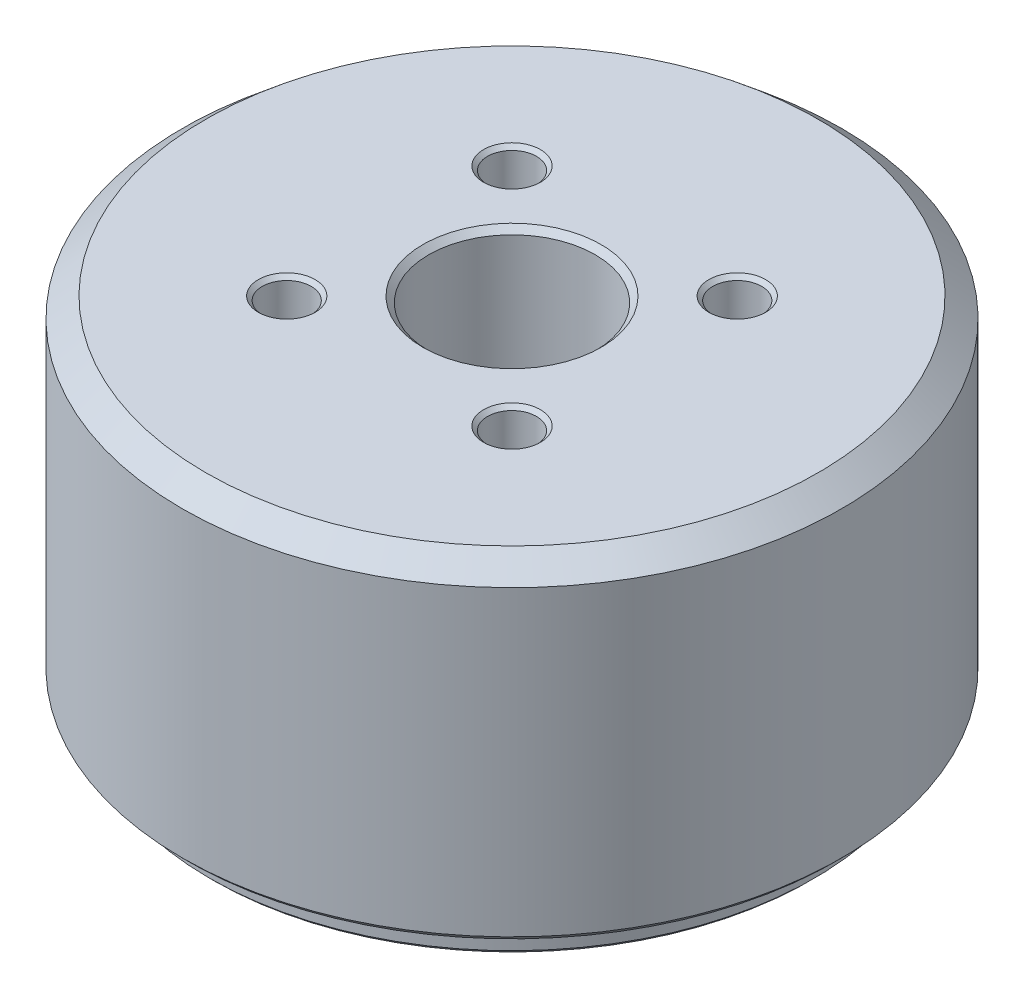
ISO-10303-21;
HEADER;
FILE_DESCRIPTION(('STEP AP214'),'2;1');
FILE_NAME('part.step','',(''),(''),'','','');
FILE_SCHEMA(('AUTOMOTIVE_DESIGN { 1 0 10303 214 1 1 1 1 }'));
ENDSEC;
DATA;
#1=APPLICATION_CONTEXT('core data for automotive mechanical design processes');
#2=APPLICATION_PROTOCOL_DEFINITION('international standard','automotive_design',2000,#1);
#3=PRODUCT_CONTEXT('',#1,'mechanical');
#4=PRODUCT('Part','Part','',(#3));
#5=PRODUCT_RELATED_PRODUCT_CATEGORY('part','',(#4));
#6=PRODUCT_DEFINITION_FORMATION('','',#4);
#7=PRODUCT_DEFINITION_CONTEXT('part definition',#1,'design');
#8=PRODUCT_DEFINITION('design','',#6,#7);
#9=PRODUCT_DEFINITION_SHAPE('','',#8);
#10=(LENGTH_UNIT() NAMED_UNIT(*) SI_UNIT(.MILLI.,.METRE.));
#11=(NAMED_UNIT(*) PLANE_ANGLE_UNIT() SI_UNIT($,.RADIAN.));
#12=(NAMED_UNIT(*) SI_UNIT($,.STERADIAN.) SOLID_ANGLE_UNIT());
#13=UNCERTAINTY_MEASURE_WITH_UNIT(LENGTH_MEASURE(1.E-05),#10,'distance_accuracy_value','');
#14=(GEOMETRIC_REPRESENTATION_CONTEXT(3) GLOBAL_UNCERTAINTY_ASSIGNED_CONTEXT((#13)) GLOBAL_UNIT_ASSIGNED_CONTEXT((#10,
#11,#12)) REPRESENTATION_CONTEXT('',''));
#15=CARTESIAN_POINT('',(0.,0.,0.));
#16=DIRECTION('',(0.,0.,1.));
#17=DIRECTION('',(1.,0.,0.));
#18=AXIS2_PLACEMENT_3D('',#15,#16,#17);
#19=CARTESIAN_POINT('',(0.,-1.76,0.));
#20=DIRECTION('',(0.,-1.,0.));
#21=DIRECTION('',(0.,0.,-1.));
#22=AXIS2_PLACEMENT_3D('',#19,#20,#21);
#23=PLANE('',#22);
#24=CARTESIAN_POINT('',(0.,-1.76,0.));
#25=DIRECTION('',(0.,-1.,0.));
#26=DIRECTION('',(0.,0.,-1.));
#27=AXIS2_PLACEMENT_3D('',#24,#25,#26);
#28=CIRCLE('',#27,5.39);
#29=CARTESIAN_POINT('',(0.,-1.76,-5.39));
#30=VERTEX_POINT('',#29);
#31=EDGE_CURVE('E45',#30,#30,#28,.T.);
#32=ORIENTED_EDGE('',*,*,#31,.T.);
#33=EDGE_LOOP('',(#32));
#34=FACE_BOUND('',#33,.T.);
#35=CARTESIAN_POINT('',(0.,-1.76,0.));
#36=DIRECTION('',(0.,-1.,0.));
#37=DIRECTION('',(0.,0.,-1.));
#38=AXIS2_PLACEMENT_3D('',#35,#36,#37);
#39=CIRCLE('',#38,4.55);
#40=CARTESIAN_POINT('',(0.,-1.76,-4.55));
#41=VERTEX_POINT('',#40);
#42=EDGE_CURVE('E226',#41,#41,#39,.F.);
#43=ORIENTED_EDGE('',*,*,#42,.T.);
#44=EDGE_LOOP('',(#43));
#45=FACE_BOUND('',#44,.T.);
#46=ADVANCED_FACE('F37',(#34,#45),#23,.T.);
#47=CARTESIAN_POINT('',(0.,-1.76,0.));
#48=DIRECTION('',(0.,1.,0.));
#49=DIRECTION('',(0.,0.,1.));
#50=AXIS2_PLACEMENT_3D('',#47,#48,#49);
#51=CYLINDRICAL_SURFACE('',#50,6.025);
#52=CARTESIAN_POINT('',(0.,0.,0.));
#53=DIRECTION('',(0.,1.,0.));
#54=DIRECTION('',(0.,0.,1.));
#55=AXIS2_PLACEMENT_3D('',#52,#53,#54);
#56=CIRCLE('',#55,6.025);
#57=CARTESIAN_POINT('',(0.,0.,6.025));
#58=VERTEX_POINT('',#57);
#59=EDGE_CURVE('E148',#58,#58,#56,.F.);
#60=ORIENTED_EDGE('',*,*,#59,.T.);
#61=EDGE_LOOP('',(#60));
#62=FACE_BOUND('',#61,.T.);
#63=CARTESIAN_POINT('',(0.,-0.500000000000002,0.));
#64=DIRECTION('',(0.,-1.,0.));
#65=DIRECTION('',(0.,0.,-1.));
#66=AXIS2_PLACEMENT_3D('',#63,#64,#65);
#67=CIRCLE('',#66,6.025);
#68=CARTESIAN_POINT('',(0.,-0.500000000000002,-6.025));
#69=VERTEX_POINT('',#68);
#70=EDGE_CURVE('E118',#69,#69,#67,.T.);
#71=ORIENTED_EDGE('',*,*,#70,.F.);
#72=EDGE_LOOP('',(#71));
#73=FACE_BOUND('',#72,.T.);
#74=ADVANCED_FACE('F243',(#62,#73),#51,.T.);
#75=CARTESIAN_POINT('',(0.,0.,0.));
#76=DIRECTION('',(0.,1.,0.));
#77=DIRECTION('',(0.,0.,1.));
#78=AXIS2_PLACEMENT_3D('',#75,#76,#77);
#79=PLANE('',#78);
#80=CARTESIAN_POINT('',(-7.75,0.,-7.75));
#81=DIRECTION('',(0.,1.,0.));
#82=DIRECTION('',(0.,0.,1.));
#83=AXIS2_PLACEMENT_3D('',#80,#81,#82);
#84=CIRCLE('',#83,1.4499999999921);
#85=CARTESIAN_POINT('',(-7.75,0.,-6.3000000000079));
#86=VERTEX_POINT('',#85);
#87=EDGE_CURVE('E181',#86,#86,#84,.T.);
#88=ORIENTED_EDGE('',*,*,#87,.T.);
#89=EDGE_LOOP('',(#88));
#90=FACE_BOUND('',#89,.T.);
#91=CARTESIAN_POINT('',(7.75,0.,-7.75));
#92=DIRECTION('',(0.,1.,0.));
#93=DIRECTION('',(0.,0.,1.));
#94=AXIS2_PLACEMENT_3D('',#91,#92,#93);
#95=CIRCLE('',#94,1.4499999999921);
#96=CARTESIAN_POINT('',(7.75,0.,-6.3000000000079));
#97=VERTEX_POINT('',#96);
#98=EDGE_CURVE('E178',#97,#97,#95,.T.);
#99=ORIENTED_EDGE('',*,*,#98,.T.);
#100=EDGE_LOOP('',(#99));
#101=FACE_BOUND('',#100,.T.);
#102=CARTESIAN_POINT('',(7.75,0.,7.75));
#103=DIRECTION('',(0.,1.,0.));
#104=DIRECTION('',(0.,0.,1.));
#105=AXIS2_PLACEMENT_3D('',#102,#103,#104);
#106=CIRCLE('',#105,1.4499999999921);
#107=CARTESIAN_POINT('',(7.75,0.,9.1999999999921));
#108=VERTEX_POINT('',#107);
#109=EDGE_CURVE('E175',#108,#108,#106,.T.);
#110=ORIENTED_EDGE('',*,*,#109,.T.);
#111=EDGE_LOOP('',(#110));
#112=FACE_BOUND('',#111,.T.);
#113=CARTESIAN_POINT('',(-7.75,0.,7.75));
#114=DIRECTION('',(0.,1.,0.));
#115=DIRECTION('',(0.,0.,1.));
#116=AXIS2_PLACEMENT_3D('',#113,#114,#115);
#117=CIRCLE('',#116,1.4499999999921);
#118=CARTESIAN_POINT('',(-7.75,0.,6.3000000000079));
#119=VERTEX_POINT('',#118);
#120=EDGE_CURVE('E172',#119,#119,#117,.T.);
#121=ORIENTED_EDGE('',*,*,#120,.T.);
#122=EDGE_LOOP('',(#121));
#123=FACE_BOUND('',#122,.T.);
#124=CARTESIAN_POINT('',(0.,0.,0.));
#125=DIRECTION('',(0.,1.,0.));
#126=DIRECTION('',(0.,0.,1.));
#127=AXIS2_PLACEMENT_3D('',#124,#125,#126);
#128=CIRCLE('',#127,15.225);
#129=CARTESIAN_POINT('',(0.,0.,15.225));
#130=VERTEX_POINT('',#129);
#131=EDGE_CURVE('E163',#130,#130,#128,.F.);
#132=ORIENTED_EDGE('',*,*,#131,.T.);
#133=EDGE_LOOP('',(#132));
#134=FACE_BOUND('',#133,.T.);
#135=DIRECTION('',(1.,0.,0.));
#136=VECTOR('',#135,1.);
#137=CARTESIAN_POINT('',(-1.025,0.,10.525));
#138=LINE('',#137,#136);
#139=CARTESIAN_POINT('',(-1.025,0.,10.525));
#140=VERTEX_POINT('',#139);
#141=CARTESIAN_POINT('',(1.025,0.,10.525));
#142=VERTEX_POINT('',#141);
#143=EDGE_CURVE('E87',#140,#142,#138,.T.);
#144=ORIENTED_EDGE('',*,*,#143,.F.);
#145=CARTESIAN_POINT('',(-1.025,0.,11.525));
#146=DIRECTION('',(0.,-1.,0.));
#147=DIRECTION('',(0.,0.,-1.));
#148=AXIS2_PLACEMENT_3D('',#145,#146,#147);
#149=CIRCLE('',#148,0.999999999999999);
#150=CARTESIAN_POINT('',(-1.025,0.,12.525));
#151=VERTEX_POINT('',#150);
#152=EDGE_CURVE('E52',#151,#140,#149,.T.);
#153=ORIENTED_EDGE('',*,*,#152,.F.);
#154=DIRECTION('',(-1.,0.,0.));
#155=VECTOR('',#154,1.);
#156=CARTESIAN_POINT('',(-1.025,0.,12.525));
#157=LINE('',#156,#155);
#158=CARTESIAN_POINT('',(1.025,0.,12.525));
#159=VERTEX_POINT('',#158);
#160=EDGE_CURVE('E103',#159,#151,#157,.T.);
#161=ORIENTED_EDGE('',*,*,#160,.F.);
#162=CARTESIAN_POINT('',(1.025,0.,11.525));
#163=DIRECTION('',(0.,-1.,0.));
#164=DIRECTION('',(0.,0.,-1.));
#165=AXIS2_PLACEMENT_3D('',#162,#163,#164);
#166=CIRCLE('',#165,0.999999999999999);
#167=EDGE_CURVE('E109',#142,#159,#166,.T.);
#168=ORIENTED_EDGE('',*,*,#167,.F.);
#169=EDGE_LOOP('',(#144,#153,#161,#168));
#170=FACE_BOUND('',#169,.T.);
#171=ORIENTED_EDGE('',*,*,#59,.F.);
#172=EDGE_LOOP('',(#171));
#173=FACE_BOUND('',#172,.T.);
#174=ADVANCED_FACE('F248',(#90,#101,#112,#123,#134,#170,#173),#79,.F.);
#175=CARTESIAN_POINT('',(0.,18.24,0.));
#176=DIRECTION('',(0.,-1.,0.));
#177=DIRECTION('',(0.,0.,-1.));
#178=AXIS2_PLACEMENT_3D('',#175,#176,#177);
#179=CYLINDRICAL_SURFACE('',#178,16.825);
#180=CARTESIAN_POINT('',(0.,1.8,0.));
#181=DIRECTION('',(0.,-1.,0.));
#182=DIRECTION('',(0.,0.,-1.));
#183=AXIS2_PLACEMENT_3D('',#180,#181,#182);
#184=CIRCLE('',#183,16.825);
#185=CARTESIAN_POINT('',(0.,1.8,-16.825));
#186=VERTEX_POINT('',#185);
#187=EDGE_CURVE('E160',#186,#186,#184,.F.);
#188=ORIENTED_EDGE('',*,*,#187,.T.);
#189=EDGE_LOOP('',(#188));
#190=FACE_BOUND('',#189,.T.);
#191=CARTESIAN_POINT('',(0.,17.24,0.));
#192=DIRECTION('',(0.,1.,0.));
#193=DIRECTION('',(0.,0.,1.));
#194=AXIS2_PLACEMENT_3D('',#191,#192,#193);
#195=CIRCLE('',#194,16.825);
#196=CARTESIAN_POINT('',(0.,17.24,16.825));
#197=VERTEX_POINT('',#196);
#198=EDGE_CURVE('E154',#197,#197,#195,.F.);
#199=ORIENTED_EDGE('',*,*,#198,.T.);
#200=EDGE_LOOP('',(#199));
#201=FACE_BOUND('',#200,.T.);
#202=ADVANCED_FACE('F262',(#190,#201),#179,.T.);
#203=CARTESIAN_POINT('',(0.,18.24,0.));
#204=DIRECTION('',(0.,1.,0.));
#205=DIRECTION('',(0.,0.,1.));
#206=AXIS2_PLACEMENT_3D('',#203,#204,#205);
#207=PLANE('',#206);
#208=CARTESIAN_POINT('',(0.,18.24,0.));
#209=DIRECTION('',(0.,1.,0.));
#210=DIRECTION('',(0.,0.,1.));
#211=AXIS2_PLACEMENT_3D('',#208,#209,#210);
#212=CIRCLE('',#211,4.55);
#213=CARTESIAN_POINT('',(0.,18.24,4.55));
#214=VERTEX_POINT('',#213);
#215=EDGE_CURVE('E220',#214,#214,#212,.F.);
#216=ORIENTED_EDGE('',*,*,#215,.T.);
#217=EDGE_LOOP('',(#216));
#218=FACE_BOUND('',#217,.T.);
#219=CARTESIAN_POINT('',(-5.75,18.24,-5.75));
#220=DIRECTION('',(0.,1.,0.));
#221=DIRECTION('',(0.,0.,1.));
#222=AXIS2_PLACEMENT_3D('',#219,#220,#221);
#223=CIRCLE('',#222,1.44999999999999);
#224=CARTESIAN_POINT('',(-5.75,18.24,-4.30000000000001));
#225=VERTEX_POINT('',#224);
#226=EDGE_CURVE('E205',#225,#225,#223,.F.);
#227=ORIENTED_EDGE('',*,*,#226,.T.);
#228=EDGE_LOOP('',(#227));
#229=FACE_BOUND('',#228,.T.);
#230=CARTESIAN_POINT('',(5.75,18.24,-5.75));
#231=DIRECTION('',(0.,1.,0.));
#232=DIRECTION('',(0.,0.,1.));
#233=AXIS2_PLACEMENT_3D('',#230,#231,#232);
#234=CIRCLE('',#233,1.44999999999999);
#235=CARTESIAN_POINT('',(5.75,18.24,-4.30000000000001));
#236=VERTEX_POINT('',#235);
#237=EDGE_CURVE('E202',#236,#236,#234,.F.);
#238=ORIENTED_EDGE('',*,*,#237,.T.);
#239=EDGE_LOOP('',(#238));
#240=FACE_BOUND('',#239,.T.);
#241=CARTESIAN_POINT('',(5.75,18.24,5.75));
#242=DIRECTION('',(0.,1.,0.));
#243=DIRECTION('',(0.,0.,1.));
#244=AXIS2_PLACEMENT_3D('',#241,#242,#243);
#245=CIRCLE('',#244,1.44999999999999);
#246=CARTESIAN_POINT('',(5.75,18.24,7.19999999999999));
#247=VERTEX_POINT('',#246);
#248=EDGE_CURVE('E199',#247,#247,#245,.F.);
#249=ORIENTED_EDGE('',*,*,#248,.T.);
#250=EDGE_LOOP('',(#249));
#251=FACE_BOUND('',#250,.T.);
#252=CARTESIAN_POINT('',(-5.75,18.24,5.75));
#253=DIRECTION('',(0.,1.,0.));
#254=DIRECTION('',(0.,0.,1.));
#255=AXIS2_PLACEMENT_3D('',#252,#253,#254);
#256=CIRCLE('',#255,1.44999999999999);
#257=CARTESIAN_POINT('',(-5.75,18.24,7.19999999999999));
#258=VERTEX_POINT('',#257);
#259=EDGE_CURVE('E196',#258,#258,#256,.F.);
#260=ORIENTED_EDGE('',*,*,#259,.T.);
#261=EDGE_LOOP('',(#260));
#262=FACE_BOUND('',#261,.T.);
#263=CARTESIAN_POINT('',(0.,18.24,0.));
#264=DIRECTION('',(0.,1.,0.));
#265=DIRECTION('',(0.,0.,1.));
#266=AXIS2_PLACEMENT_3D('',#263,#264,#265);
#267=CIRCLE('',#266,15.6332464074058);
#268=CARTESIAN_POINT('',(0.,18.24,15.6332464074058));
#269=VERTEX_POINT('',#268);
#270=EDGE_CURVE('E151',#269,#269,#267,.T.);
#271=ORIENTED_EDGE('',*,*,#270,.T.);
#272=EDGE_LOOP('',(#271));
#273=FACE_BOUND('',#272,.T.);
#274=ADVANCED_FACE('F258',(#218,#229,#240,#251,#262,#273),#207,.T.);
#275=CARTESIAN_POINT('',(0.,18.24,0.));
#276=DIRECTION('',(0.,-1.,0.));
#277=DIRECTION('',(0.,0.,-1.));
#278=AXIS2_PLACEMENT_3D('',#275,#276,#277);
#279=CYLINDRICAL_SURFACE('',#278,4.25);
#280=CARTESIAN_POINT('',(0.,-1.46,0.));
#281=DIRECTION('',(0.,-1.,0.));
#282=DIRECTION('',(0.,0.,-1.));
#283=AXIS2_PLACEMENT_3D('',#280,#281,#282);
#284=CIRCLE('',#283,4.25);
#285=CARTESIAN_POINT('',(0.,-1.46,-4.25));
#286=VERTEX_POINT('',#285);
#287=EDGE_CURVE('E223',#286,#286,#284,.T.);
#288=ORIENTED_EDGE('',*,*,#287,.T.);
#289=EDGE_LOOP('',(#288));
#290=FACE_BOUND('',#289,.T.);
#291=CARTESIAN_POINT('',(0.,17.94,0.));
#292=DIRECTION('',(0.,1.,0.));
#293=DIRECTION('',(0.,0.,1.));
#294=AXIS2_PLACEMENT_3D('',#291,#292,#293);
#295=CIRCLE('',#294,4.25);
#296=CARTESIAN_POINT('',(0.,17.94,4.25));
#297=VERTEX_POINT('',#296);
#298=EDGE_CURVE('E217',#297,#297,#295,.T.);
#299=ORIENTED_EDGE('',*,*,#298,.T.);
#300=EDGE_LOOP('',(#299));
#301=FACE_BOUND('',#300,.T.);
#302=ADVANCED_FACE('F255',(#290,#301),#279,.F.);
#303=CARTESIAN_POINT('',(-7.75,4.5,7.75));
#304=DIRECTION('',(0.,-1.,0.));
#305=DIRECTION('',(0.,0.,-1.));
#306=AXIS2_PLACEMENT_3D('',#303,#304,#305);
#307=CYLINDRICAL_SURFACE('',#306,1.2499999999921);
#308=CARTESIAN_POINT('',(-7.75,0.20000000000001,7.75));
#309=DIRECTION('',(0.,1.,0.));
#310=DIRECTION('',(0.,0.,1.));
#311=AXIS2_PLACEMENT_3D('',#308,#309,#310);
#312=CIRCLE('',#311,1.2499999999921);
#313=CARTESIAN_POINT('',(-7.75,0.20000000000001,6.5000000000079));
#314=VERTEX_POINT('',#313);
#315=EDGE_CURVE('E190',#314,#314,#312,.F.);
#316=ORIENTED_EDGE('',*,*,#315,.T.);
#317=EDGE_LOOP('',(#316));
#318=FACE_BOUND('',#317,.T.);
#319=CARTESIAN_POINT('',(-7.75,4.5,7.75));
#320=DIRECTION('',(0.,-1.,0.));
#321=DIRECTION('',(0.,0.,-1.));
#322=AXIS2_PLACEMENT_3D('',#319,#320,#321);
#323=CIRCLE('',#322,1.2499999999921);
#324=CARTESIAN_POINT('',(-7.75,4.5,6.5000000000079));
#325=VERTEX_POINT('',#324);
#326=EDGE_CURVE('E143',#325,#325,#323,.T.);
#327=ORIENTED_EDGE('',*,*,#326,.F.);
#328=EDGE_LOOP('',(#327));
#329=FACE_BOUND('',#328,.T.);
#330=ADVANCED_FACE('F252',(#318,#329),#307,.F.);
#331=CARTESIAN_POINT('',(-7.75,4.5,7.75));
#332=DIRECTION('',(0.,-1.,0.));
#333=DIRECTION('',(0.,0.,-1.));
#334=AXIS2_PLACEMENT_3D('',#331,#332,#333);
#335=PLANE('',#334);
#336=ORIENTED_EDGE('',*,*,#326,.T.);
#337=EDGE_LOOP('',(#336));
#338=FACE_BOUND('',#337,.T.);
#339=ADVANCED_FACE('F420',(#338),#335,.T.);
#340=CARTESIAN_POINT('',(7.75,4.5,-7.75));
#341=DIRECTION('',(0.,-1.,0.));
#342=DIRECTION('',(0.,0.,-1.));
#343=AXIS2_PLACEMENT_3D('',#340,#341,#342);
#344=CYLINDRICAL_SURFACE('',#343,1.2499999999921);
#345=CARTESIAN_POINT('',(7.75,0.200000000000002,-7.75));
#346=DIRECTION('',(0.,1.,0.));
#347=DIRECTION('',(0.,0.,1.));
#348=AXIS2_PLACEMENT_3D('',#345,#346,#347);
#349=CIRCLE('',#348,1.2499999999921);
#350=CARTESIAN_POINT('',(7.75,0.200000000000002,-6.5000000000079));
#351=VERTEX_POINT('',#350);
#352=EDGE_CURVE('E184',#351,#351,#349,.F.);
#353=ORIENTED_EDGE('',*,*,#352,.T.);
#354=EDGE_LOOP('',(#353));
#355=FACE_BOUND('',#354,.T.);
#356=CARTESIAN_POINT('',(7.75,4.5,-7.75));
#357=DIRECTION('',(0.,-1.,0.));
#358=DIRECTION('',(0.,0.,-1.));
#359=AXIS2_PLACEMENT_3D('',#356,#357,#358);
#360=CIRCLE('',#359,1.2499999999921);
#361=CARTESIAN_POINT('',(7.75,4.5,-8.9999999999921));
#362=VERTEX_POINT('',#361);
#363=EDGE_CURVE('E136',#362,#362,#360,.T.);
#364=ORIENTED_EDGE('',*,*,#363,.F.);
#365=EDGE_LOOP('',(#364));
#366=FACE_BOUND('',#365,.T.);
#367=ADVANCED_FACE('F416',(#355,#366),#344,.F.);
#368=CARTESIAN_POINT('',(7.75,4.5,-7.75));
#369=DIRECTION('',(0.,-1.,0.));
#370=DIRECTION('',(0.,0.,-1.));
#371=AXIS2_PLACEMENT_3D('',#368,#369,#370);
#372=PLANE('',#371);
#373=ORIENTED_EDGE('',*,*,#363,.T.);
#374=EDGE_LOOP('',(#373));
#375=FACE_BOUND('',#374,.T.);
#376=ADVANCED_FACE('F412',(#375),#372,.T.);
#377=CARTESIAN_POINT('',(7.75,4.5,7.75));
#378=DIRECTION('',(0.,-1.,0.));
#379=DIRECTION('',(0.,0.,-1.));
#380=AXIS2_PLACEMENT_3D('',#377,#378,#379);
#381=CYLINDRICAL_SURFACE('',#380,1.2499999999921);
#382=CARTESIAN_POINT('',(7.75,0.200000000000001,7.75));
#383=DIRECTION('',(0.,1.,0.));
#384=DIRECTION('',(0.,0.,1.));
#385=AXIS2_PLACEMENT_3D('',#382,#383,#384);
#386=CIRCLE('',#385,1.2499999999921);
#387=CARTESIAN_POINT('',(7.75,0.200000000000001,8.9999999999921));
#388=VERTEX_POINT('',#387);
#389=EDGE_CURVE('E187',#388,#388,#386,.F.);
#390=ORIENTED_EDGE('',*,*,#389,.T.);
#391=EDGE_LOOP('',(#390));
#392=FACE_BOUND('',#391,.T.);
#393=CARTESIAN_POINT('',(7.75,4.5,7.75));
#394=DIRECTION('',(0.,-1.,0.));
#395=DIRECTION('',(0.,0.,-1.));
#396=AXIS2_PLACEMENT_3D('',#393,#394,#395);
#397=CIRCLE('',#396,1.2499999999921);
#398=CARTESIAN_POINT('',(7.75,4.5,6.5000000000079));
#399=VERTEX_POINT('',#398);
#400=EDGE_CURVE('E139',#399,#399,#397,.T.);
#401=ORIENTED_EDGE('',*,*,#400,.F.);
#402=EDGE_LOOP('',(#401));
#403=FACE_BOUND('',#402,.T.);
#404=ADVANCED_FACE('F415',(#392,#403),#381,.F.);
#405=CARTESIAN_POINT('',(7.75,4.5,7.75));
#406=DIRECTION('',(0.,-1.,0.));
#407=DIRECTION('',(0.,0.,-1.));
#408=AXIS2_PLACEMENT_3D('',#405,#406,#407);
#409=PLANE('',#408);
#410=ORIENTED_EDGE('',*,*,#400,.T.);
#411=EDGE_LOOP('',(#410));
#412=FACE_BOUND('',#411,.T.);
#413=ADVANCED_FACE('F428',(#412),#409,.T.);
#414=CARTESIAN_POINT('',(-7.75,4.5,-7.75));
#415=DIRECTION('',(0.,-1.,0.));
#416=DIRECTION('',(0.,0.,-1.));
#417=AXIS2_PLACEMENT_3D('',#414,#415,#416);
#418=CYLINDRICAL_SURFACE('',#417,1.2499999999921);
#419=CARTESIAN_POINT('',(-7.75,0.200000000000002,-7.75));
#420=DIRECTION('',(0.,1.,0.));
#421=DIRECTION('',(0.,0.,1.));
#422=AXIS2_PLACEMENT_3D('',#419,#420,#421);
#423=CIRCLE('',#422,1.2499999999921);
#424=CARTESIAN_POINT('',(-7.75,0.200000000000002,-6.5000000000079));
#425=VERTEX_POINT('',#424);
#426=EDGE_CURVE('E169',#425,#425,#423,.F.);
#427=ORIENTED_EDGE('',*,*,#426,.T.);
#428=EDGE_LOOP('',(#427));
#429=FACE_BOUND('',#428,.T.);
#430=CARTESIAN_POINT('',(-7.75,4.5,-7.75));
#431=DIRECTION('',(0.,-1.,0.));
#432=DIRECTION('',(0.,0.,-1.));
#433=AXIS2_PLACEMENT_3D('',#430,#431,#432);
#434=CIRCLE('',#433,1.2499999999921);
#435=CARTESIAN_POINT('',(-7.75,4.5,-8.9999999999921));
#436=VERTEX_POINT('',#435);
#437=EDGE_CURVE('E140',#436,#436,#434,.T.);
#438=ORIENTED_EDGE('',*,*,#437,.F.);
#439=EDGE_LOOP('',(#438));
#440=FACE_BOUND('',#439,.T.);
#441=ADVANCED_FACE('F424',(#429,#440),#418,.F.);
#442=CARTESIAN_POINT('',(-7.75,4.5,-7.75));
#443=DIRECTION('',(0.,-1.,0.));
#444=DIRECTION('',(0.,0.,-1.));
#445=AXIS2_PLACEMENT_3D('',#442,#443,#444);
#446=PLANE('',#445);
#447=ORIENTED_EDGE('',*,*,#437,.T.);
#448=EDGE_LOOP('',(#447));
#449=FACE_BOUND('',#448,.T.);
#450=ADVANCED_FACE('F410',(#449),#446,.T.);
#451=CARTESIAN_POINT('',(-5.75,15.74,-5.75));
#452=DIRECTION('',(0.,1.,0.));
#453=DIRECTION('',(0.,0.,1.));
#454=AXIS2_PLACEMENT_3D('',#451,#452,#453);
#455=CYLINDRICAL_SURFACE('',#454,1.25);
#456=CARTESIAN_POINT('',(-5.75,18.04,-5.75));
#457=DIRECTION('',(0.,1.,0.));
#458=DIRECTION('',(0.,0.,1.));
#459=AXIS2_PLACEMENT_3D('',#456,#457,#458);
#460=CIRCLE('',#459,1.25);
#461=CARTESIAN_POINT('',(-5.75,18.04,-4.5));
#462=VERTEX_POINT('',#461);
#463=EDGE_CURVE('E193',#462,#462,#460,.T.);
#464=ORIENTED_EDGE('',*,*,#463,.T.);
#465=EDGE_LOOP('',(#464));
#466=FACE_BOUND('',#465,.T.);
#467=CARTESIAN_POINT('',(-5.75,15.74,-5.75));
#468=DIRECTION('',(0.,1.,0.));
#469=DIRECTION('',(0.,0.,1.));
#470=AXIS2_PLACEMENT_3D('',#467,#468,#469);
#471=CIRCLE('',#470,1.25);
#472=CARTESIAN_POINT('',(-5.75,15.74,-4.5));
#473=VERTEX_POINT('',#472);
#474=EDGE_CURVE('E128',#473,#473,#471,.T.);
#475=ORIENTED_EDGE('',*,*,#474,.F.);
#476=EDGE_LOOP('',(#475));
#477=FACE_BOUND('',#476,.T.);
#478=ADVANCED_FACE('F406',(#466,#477),#455,.F.);
#479=CARTESIAN_POINT('',(-5.75,15.74,-5.75));
#480=DIRECTION('',(0.,1.,0.));
#481=DIRECTION('',(0.,0.,1.));
#482=AXIS2_PLACEMENT_3D('',#479,#480,#481);
#483=PLANE('',#482);
#484=ORIENTED_EDGE('',*,*,#474,.T.);
#485=EDGE_LOOP('',(#484));
#486=FACE_BOUND('',#485,.T.);
#487=ADVANCED_FACE('F376',(#486),#483,.T.);
#488=CARTESIAN_POINT('',(-5.75,15.74,5.75));
#489=DIRECTION('',(0.,1.,0.));
#490=DIRECTION('',(0.,0.,1.));
#491=AXIS2_PLACEMENT_3D('',#488,#489,#490);
#492=CYLINDRICAL_SURFACE('',#491,1.25);
#493=CARTESIAN_POINT('',(-5.75,18.04,5.75));
#494=DIRECTION('',(0.,1.,0.));
#495=DIRECTION('',(0.,0.,1.));
#496=AXIS2_PLACEMENT_3D('',#493,#494,#495);
#497=CIRCLE('',#496,1.25);
#498=CARTESIAN_POINT('',(-5.75,18.04,7.));
#499=VERTEX_POINT('',#498);
#500=EDGE_CURVE('E214',#499,#499,#497,.T.);
#501=ORIENTED_EDGE('',*,*,#500,.T.);
#502=EDGE_LOOP('',(#501));
#503=FACE_BOUND('',#502,.T.);
#504=CARTESIAN_POINT('',(-5.75,15.74,5.75));
#505=DIRECTION('',(0.,1.,0.));
#506=DIRECTION('',(0.,0.,1.));
#507=AXIS2_PLACEMENT_3D('',#504,#505,#506);
#508=CIRCLE('',#507,1.25);
#509=CARTESIAN_POINT('',(-5.75,15.74,7.));
#510=VERTEX_POINT('',#509);
#511=EDGE_CURVE('E125',#510,#510,#508,.T.);
#512=ORIENTED_EDGE('',*,*,#511,.F.);
#513=EDGE_LOOP('',(#512));
#514=FACE_BOUND('',#513,.T.);
#515=ADVANCED_FACE('F372',(#503,#514),#492,.F.);
#516=CARTESIAN_POINT('',(-5.75,15.74,5.75));
#517=DIRECTION('',(0.,1.,0.));
#518=DIRECTION('',(0.,0.,1.));
#519=AXIS2_PLACEMENT_3D('',#516,#517,#518);
#520=PLANE('',#519);
#521=ORIENTED_EDGE('',*,*,#511,.T.);
#522=EDGE_LOOP('',(#521));
#523=FACE_BOUND('',#522,.T.);
#524=ADVANCED_FACE('F375',(#523),#520,.T.);
#525=CARTESIAN_POINT('',(5.75,15.74,5.75));
#526=DIRECTION('',(0.,1.,0.));
#527=DIRECTION('',(0.,0.,1.));
#528=AXIS2_PLACEMENT_3D('',#525,#526,#527);
#529=CYLINDRICAL_SURFACE('',#528,1.25);
#530=CARTESIAN_POINT('',(5.75,18.04,5.75));
#531=DIRECTION('',(0.,1.,0.));
#532=DIRECTION('',(0.,0.,1.));
#533=AXIS2_PLACEMENT_3D('',#530,#531,#532);
#534=CIRCLE('',#533,1.25);
#535=CARTESIAN_POINT('',(5.75,18.04,7.));
#536=VERTEX_POINT('',#535);
#537=EDGE_CURVE('E211',#536,#536,#534,.T.);
#538=ORIENTED_EDGE('',*,*,#537,.T.);
#539=EDGE_LOOP('',(#538));
#540=FACE_BOUND('',#539,.T.);
#541=CARTESIAN_POINT('',(5.75,15.74,5.75));
#542=DIRECTION('',(0.,1.,0.));
#543=DIRECTION('',(0.,0.,1.));
#544=AXIS2_PLACEMENT_3D('',#541,#542,#543);
#545=CIRCLE('',#544,1.25);
#546=CARTESIAN_POINT('',(5.75,15.74,7.));
#547=VERTEX_POINT('',#546);
#548=EDGE_CURVE('E129',#547,#547,#545,.T.);
#549=ORIENTED_EDGE('',*,*,#548,.F.);
#550=EDGE_LOOP('',(#549));
#551=FACE_BOUND('',#550,.T.);
#552=ADVANCED_FACE('F381',(#540,#551),#529,.F.);
#553=CARTESIAN_POINT('',(5.75,15.74,5.75));
#554=DIRECTION('',(0.,1.,0.));
#555=DIRECTION('',(0.,0.,1.));
#556=AXIS2_PLACEMENT_3D('',#553,#554,#555);
#557=PLANE('',#556);
#558=ORIENTED_EDGE('',*,*,#548,.T.);
#559=EDGE_LOOP('',(#558));
#560=FACE_BOUND('',#559,.T.);
#561=ADVANCED_FACE('F386',(#560),#557,.T.);
#562=CARTESIAN_POINT('',(5.75,15.74,-5.75));
#563=DIRECTION('',(0.,1.,0.));
#564=DIRECTION('',(0.,0.,1.));
#565=AXIS2_PLACEMENT_3D('',#562,#563,#564);
#566=CYLINDRICAL_SURFACE('',#565,1.25);
#567=CARTESIAN_POINT('',(5.75,18.04,-5.75));
#568=DIRECTION('',(0.,1.,0.));
#569=DIRECTION('',(0.,0.,1.));
#570=AXIS2_PLACEMENT_3D('',#567,#568,#569);
#571=CIRCLE('',#570,1.25);
#572=CARTESIAN_POINT('',(5.75,18.04,-4.5));
#573=VERTEX_POINT('',#572);
#574=EDGE_CURVE('E208',#573,#573,#571,.T.);
#575=ORIENTED_EDGE('',*,*,#574,.T.);
#576=EDGE_LOOP('',(#575));
#577=FACE_BOUND('',#576,.T.);
#578=CARTESIAN_POINT('',(5.75,15.74,-5.75));
#579=DIRECTION('',(0.,1.,0.));
#580=DIRECTION('',(0.,0.,1.));
#581=AXIS2_PLACEMENT_3D('',#578,#579,#580);
#582=CIRCLE('',#581,1.25);
#583=CARTESIAN_POINT('',(5.75,15.74,-4.5));
#584=VERTEX_POINT('',#583);
#585=EDGE_CURVE('E124',#584,#584,#582,.T.);
#586=ORIENTED_EDGE('',*,*,#585,.F.);
#587=EDGE_LOOP('',(#586));
#588=FACE_BOUND('',#587,.T.);
#589=ADVANCED_FACE('F394',(#577,#588),#566,.F.);
#590=CARTESIAN_POINT('',(5.75,15.74,-5.75));
#591=DIRECTION('',(0.,1.,0.));
#592=DIRECTION('',(0.,0.,1.));
#593=AXIS2_PLACEMENT_3D('',#590,#591,#592);
#594=PLANE('',#593);
#595=ORIENTED_EDGE('',*,*,#585,.T.);
#596=EDGE_LOOP('',(#595));
#597=FACE_BOUND('',#596,.T.);
#598=ADVANCED_FACE('F397',(#597),#594,.T.);
#599=CARTESIAN_POINT('',(0.,1.5,0.));
#600=DIRECTION('',(0.,-1.,0.));
#601=DIRECTION('',(0.,0.,-1.));
#602=AXIS2_PLACEMENT_3D('',#599,#600,#601);
#603=PLANE('',#602);
#604=CARTESIAN_POINT('',(0.,1.5,0.));
#605=DIRECTION('',(0.,-1.,0.));
#606=DIRECTION('',(0.,0.,-1.));
#607=AXIS2_PLACEMENT_3D('',#604,#605,#606);
#608=CIRCLE('',#607,16.525);
#609=CARTESIAN_POINT('',(0.,1.5,-16.525));
#610=VERTEX_POINT('',#609);
#611=EDGE_CURVE('E157',#610,#610,#608,.T.);
#612=ORIENTED_EDGE('',*,*,#611,.T.);
#613=EDGE_LOOP('',(#612));
#614=FACE_BOUND('',#613,.T.);
#615=CARTESIAN_POINT('',(0.,1.5,0.));
#616=DIRECTION('',(0.,-1.,0.));
#617=DIRECTION('',(0.,0.,-1.));
#618=AXIS2_PLACEMENT_3D('',#615,#616,#617);
#619=CIRCLE('',#618,15.425);
#620=CARTESIAN_POINT('',(0.,1.5,-15.425));
#621=VERTEX_POINT('',#620);
#622=EDGE_CURVE('E121',#621,#621,#619,.T.);
#623=ORIENTED_EDGE('',*,*,#622,.F.);
#624=EDGE_LOOP('',(#623));
#625=FACE_BOUND('',#624,.T.);
#626=ADVANCED_FACE('F390',(#614,#625),#603,.T.);
#627=CARTESIAN_POINT('',(0.,1.5,0.));
#628=DIRECTION('',(0.,-1.,0.));
#629=DIRECTION('',(0.,0.,-1.));
#630=AXIS2_PLACEMENT_3D('',#627,#628,#629);
#631=CYLINDRICAL_SURFACE('',#630,15.425);
#632=CARTESIAN_POINT('',(0.,0.200000000000001,0.));
#633=DIRECTION('',(0.,1.,0.));
#634=DIRECTION('',(0.,0.,1.));
#635=AXIS2_PLACEMENT_3D('',#632,#633,#634);
#636=CIRCLE('',#635,15.425);
#637=CARTESIAN_POINT('',(0.,0.200000000000001,15.425));
#638=VERTEX_POINT('',#637);
#639=EDGE_CURVE('E166',#638,#638,#636,.T.);
#640=ORIENTED_EDGE('',*,*,#639,.T.);
#641=EDGE_LOOP('',(#640));
#642=FACE_BOUND('',#641,.T.);
#643=ORIENTED_EDGE('',*,*,#622,.T.);
#644=EDGE_LOOP('',(#643));
#645=FACE_BOUND('',#644,.T.);
#646=ADVANCED_FACE('F490',(#642,#645),#631,.T.);
#647=CARTESIAN_POINT('',(0.,-0.500000000000002,0.));
#648=DIRECTION('',(0.,-1.,0.));
#649=DIRECTION('',(0.,0.,-1.));
#650=AXIS2_PLACEMENT_3D('',#647,#648,#649);
#651=PLANE('',#650);
#652=CARTESIAN_POINT('',(0.,-0.500000000000002,0.));
#653=DIRECTION('',(0.,-1.,0.));
#654=DIRECTION('',(0.,0.,-1.));
#655=AXIS2_PLACEMENT_3D('',#652,#653,#654);
#656=CIRCLE('',#655,5.79);
#657=CARTESIAN_POINT('',(0.,-0.500000000000002,-5.79));
#658=VERTEX_POINT('',#657);
#659=EDGE_CURVE('E113',#658,#658,#656,.T.);
#660=ORIENTED_EDGE('',*,*,#659,.F.);
#661=EDGE_LOOP('',(#660));
#662=FACE_BOUND('',#661,.T.);
#663=ORIENTED_EDGE('',*,*,#70,.T.);
#664=EDGE_LOOP('',(#663));
#665=FACE_BOUND('',#664,.T.);
#666=ADVANCED_FACE('F484',(#662,#665),#651,.T.);
#667=CARTESIAN_POINT('',(0.,-0.500000000000002,0.));
#668=DIRECTION('',(0.,-1.,0.));
#669=DIRECTION('',(0.,0.,-1.));
#670=AXIS2_PLACEMENT_3D('',#667,#668,#669);
#671=CYLINDRICAL_SURFACE('',#670,5.79);
#672=CARTESIAN_POINT('',(0.,-1.36,0.));
#673=DIRECTION('',(0.,-1.,0.));
#674=DIRECTION('',(0.,0.,-1.));
#675=AXIS2_PLACEMENT_3D('',#672,#673,#674);
#676=CIRCLE('',#675,5.79);
#677=CARTESIAN_POINT('',(0.,-1.36,-5.79));
#678=VERTEX_POINT('',#677);
#679=EDGE_CURVE('E11',#678,#678,#676,.F.);
#680=ORIENTED_EDGE('',*,*,#679,.T.);
#681=EDGE_LOOP('',(#680));
#682=FACE_BOUND('',#681,.T.);
#683=ORIENTED_EDGE('',*,*,#659,.T.);
#684=EDGE_LOOP('',(#683));
#685=FACE_BOUND('',#684,.T.);
#686=ADVANCED_FACE('F489',(#682,#685),#671,.T.);
#687=CARTESIAN_POINT('',(-1.025,0.5,11.525));
#688=DIRECTION('',(0.,-1.,0.));
#689=DIRECTION('',(0.,0.,-1.));
#690=AXIS2_PLACEMENT_3D('',#687,#688,#689);
#691=CYLINDRICAL_SURFACE('',#690,0.999999999999999);
#692=ORIENTED_EDGE('',*,*,#152,.T.);
#693=DIRECTION('',(0.,-1.,0.));
#694=VECTOR('',#693,1.);
#695=CARTESIAN_POINT('',(-1.025,0.5,10.525));
#696=LINE('',#695,#694);
#697=CARTESIAN_POINT('',(-1.025,0.5,10.525));
#698=VERTEX_POINT('',#697);
#699=EDGE_CURVE('E75',#698,#140,#696,.T.);
#700=ORIENTED_EDGE('',*,*,#699,.F.);
#701=CARTESIAN_POINT('',(-1.025,0.5,11.525));
#702=DIRECTION('',(0.,-1.,0.));
#703=DIRECTION('',(0.,0.,-1.));
#704=AXIS2_PLACEMENT_3D('',#701,#702,#703);
#705=CIRCLE('',#704,0.999999999999999);
#706=CARTESIAN_POINT('',(-1.025,0.5,12.525));
#707=VERTEX_POINT('',#706);
#708=EDGE_CURVE('E101',#707,#698,#705,.T.);
#709=ORIENTED_EDGE('',*,*,#708,.F.);
#710=DIRECTION('',(0.,-1.,0.));
#711=VECTOR('',#710,1.);
#712=CARTESIAN_POINT('',(-1.025,0.5,12.525));
#713=LINE('',#712,#711);
#714=EDGE_CURVE('E60',#707,#151,#713,.T.);
#715=ORIENTED_EDGE('',*,*,#714,.T.);
#716=EDGE_LOOP('',(#692,#700,#709,#715));
#717=FACE_BOUND('',#716,.T.);
#718=ADVANCED_FACE('F499',(#717),#691,.F.);
#719=CARTESIAN_POINT('',(-1.025,0.5,12.525));
#720=DIRECTION('',(0.,0.,1.));
#721=DIRECTION('',(1.,0.,0.));
#722=AXIS2_PLACEMENT_3D('',#719,#720,#721);
#723=PLANE('',#722);
#724=ORIENTED_EDGE('',*,*,#160,.T.);
#725=ORIENTED_EDGE('',*,*,#714,.F.);
#726=DIRECTION('',(-1.,0.,0.));
#727=VECTOR('',#726,1.);
#728=CARTESIAN_POINT('',(-1.025,0.5,12.525));
#729=LINE('',#728,#727);
#730=CARTESIAN_POINT('',(1.025,0.5,12.525));
#731=VERTEX_POINT('',#730);
#732=EDGE_CURVE('E98',#731,#707,#729,.T.);
#733=ORIENTED_EDGE('',*,*,#732,.F.);
#734=DIRECTION('',(0.,-1.,0.));
#735=VECTOR('',#734,1.);
#736=CARTESIAN_POINT('',(1.025,0.5,12.525));
#737=LINE('',#736,#735);
#738=EDGE_CURVE('E91',#731,#159,#737,.T.);
#739=ORIENTED_EDGE('',*,*,#738,.T.);
#740=EDGE_LOOP('',(#724,#725,#733,#739));
#741=FACE_BOUND('',#740,.T.);
#742=ADVANCED_FACE('F504',(#741),#723,.F.);
#743=CARTESIAN_POINT('',(1.025,0.5,11.525));
#744=DIRECTION('',(0.,-1.,0.));
#745=DIRECTION('',(0.,0.,-1.));
#746=AXIS2_PLACEMENT_3D('',#743,#744,#745);
#747=CYLINDRICAL_SURFACE('',#746,0.999999999999999);
#748=ORIENTED_EDGE('',*,*,#167,.T.);
#749=ORIENTED_EDGE('',*,*,#738,.F.);
#750=CARTESIAN_POINT('',(1.025,0.5,11.525));
#751=DIRECTION('',(0.,-1.,0.));
#752=DIRECTION('',(0.,0.,-1.));
#753=AXIS2_PLACEMENT_3D('',#750,#751,#752);
#754=CIRCLE('',#753,0.999999999999999);
#755=CARTESIAN_POINT('',(1.025,0.5,10.525));
#756=VERTEX_POINT('',#755);
#757=EDGE_CURVE('E94',#756,#731,#754,.T.);
#758=ORIENTED_EDGE('',*,*,#757,.F.);
#759=DIRECTION('',(0.,-1.,0.));
#760=VECTOR('',#759,1.);
#761=CARTESIAN_POINT('',(1.025,0.5,10.525));
#762=LINE('',#761,#760);
#763=EDGE_CURVE('E80',#756,#142,#762,.T.);
#764=ORIENTED_EDGE('',*,*,#763,.T.);
#765=EDGE_LOOP('',(#748,#749,#758,#764));
#766=FACE_BOUND('',#765,.T.);
#767=ADVANCED_FACE('F95',(#766),#747,.F.);
#768=CARTESIAN_POINT('',(-1.025,0.5,10.525));
#769=DIRECTION('',(0.,0.,-1.));
#770=DIRECTION('',(-1.,0.,0.));
#771=AXIS2_PLACEMENT_3D('',#768,#769,#770);
#772=PLANE('',#771);
#773=ORIENTED_EDGE('',*,*,#143,.T.);
#774=ORIENTED_EDGE('',*,*,#763,.F.);
#775=DIRECTION('',(1.,0.,0.));
#776=VECTOR('',#775,1.);
#777=CARTESIAN_POINT('',(-1.025,0.5,10.525));
#778=LINE('',#777,#776);
#779=EDGE_CURVE('E84',#698,#756,#778,.T.);
#780=ORIENTED_EDGE('',*,*,#779,.F.);
#781=ORIENTED_EDGE('',*,*,#699,.T.);
#782=EDGE_LOOP('',(#773,#774,#780,#781));
#783=FACE_BOUND('',#782,.T.);
#784=ADVANCED_FACE('F82',(#783),#772,.F.);
#785=CARTESIAN_POINT('',(-1.025,0.5,11.525));
#786=DIRECTION('',(0.,-1.,0.));
#787=DIRECTION('',(0.,0.,-1.));
#788=AXIS2_PLACEMENT_3D('',#785,#786,#787);
#789=PLANE('',#788);
#790=ORIENTED_EDGE('',*,*,#708,.T.);
#791=ORIENTED_EDGE('',*,*,#779,.T.);
#792=ORIENTED_EDGE('',*,*,#757,.T.);
#793=ORIENTED_EDGE('',*,*,#732,.T.);
#794=EDGE_LOOP('',(#790,#791,#792,#793));
#795=FACE_BOUND('',#794,.T.);
#796=ADVANCED_FACE('F100',(#795),#789,.T.);
#797=CARTESIAN_POINT('',(0.,18.24,0.));
#798=DIRECTION('',(0.,-1.,0.));
#799=DIRECTION('',(0.,0.,-1.));
#800=AXIS2_PLACEMENT_3D('',#797,#798,#799);
#801=CONICAL_SURFACE('',#800,15.6332464074058,0.872664625997166);
#802=ORIENTED_EDGE('',*,*,#198,.F.);
#803=EDGE_LOOP('',(#802));
#804=FACE_BOUND('',#803,.T.);
#805=ORIENTED_EDGE('',*,*,#270,.F.);
#806=EDGE_LOOP('',(#805));
#807=FACE_BOUND('',#806,.T.);
#808=ADVANCED_FACE('F271',(#804,#807),#801,.T.);
#809=CARTESIAN_POINT('',(0.,1.5,0.));
#810=DIRECTION('',(0.,1.,0.));
#811=DIRECTION('',(0.,0.,1.));
#812=AXIS2_PLACEMENT_3D('',#809,#810,#811);
#813=CONICAL_SURFACE('',#812,16.525,0.785398163397466);
#814=ORIENTED_EDGE('',*,*,#187,.F.);
#815=EDGE_LOOP('',(#814));
#816=FACE_BOUND('',#815,.T.);
#817=ORIENTED_EDGE('',*,*,#611,.F.);
#818=EDGE_LOOP('',(#817));
#819=FACE_BOUND('',#818,.T.);
#820=ADVANCED_FACE('F277',(#816,#819),#813,.T.);
#821=CARTESIAN_POINT('',(0.,0.,0.));
#822=DIRECTION('',(0.,1.,0.));
#823=DIRECTION('',(0.,0.,1.));
#824=AXIS2_PLACEMENT_3D('',#821,#822,#823);
#825=CONICAL_SURFACE('',#824,15.225,0.785398163397444);
#826=ORIENTED_EDGE('',*,*,#639,.F.);
#827=EDGE_LOOP('',(#826));
#828=FACE_BOUND('',#827,.T.);
#829=ORIENTED_EDGE('',*,*,#131,.F.);
#830=EDGE_LOOP('',(#829));
#831=FACE_BOUND('',#830,.T.);
#832=ADVANCED_FACE('F284',(#828,#831),#825,.T.);
#833=CARTESIAN_POINT('',(-7.75,0.200000000000002,-7.75));
#834=DIRECTION('',(0.,-1.,0.));
#835=DIRECTION('',(0.,0.,-1.));
#836=AXIS2_PLACEMENT_3D('',#833,#834,#835);
#837=CONICAL_SURFACE('',#836,1.2499999999921,0.785398163397455);
#838=ORIENTED_EDGE('',*,*,#87,.F.);
#839=EDGE_LOOP('',(#838));
#840=FACE_BOUND('',#839,.T.);
#841=ORIENTED_EDGE('',*,*,#426,.F.);
#842=EDGE_LOOP('',(#841));
#843=FACE_BOUND('',#842,.T.);
#844=ADVANCED_FACE('F291',(#840,#843),#837,.F.);
#845=CARTESIAN_POINT('',(7.75,0.200000000000002,-7.75));
#846=DIRECTION('',(0.,-1.,0.));
#847=DIRECTION('',(0.,0.,-1.));
#848=AXIS2_PLACEMENT_3D('',#845,#846,#847);
#849=CONICAL_SURFACE('',#848,1.2499999999921,0.785398163397455);
#850=ORIENTED_EDGE('',*,*,#98,.F.);
#851=EDGE_LOOP('',(#850));
#852=FACE_BOUND('',#851,.T.);
#853=ORIENTED_EDGE('',*,*,#352,.F.);
#854=EDGE_LOOP('',(#853));
#855=FACE_BOUND('',#854,.T.);
#856=ADVANCED_FACE('F298',(#852,#855),#849,.F.);
#857=CARTESIAN_POINT('',(7.75,0.200000000000001,7.75));
#858=DIRECTION('',(0.,-1.,0.));
#859=DIRECTION('',(0.,0.,-1.));
#860=AXIS2_PLACEMENT_3D('',#857,#858,#859);
#861=CONICAL_SURFACE('',#860,1.2499999999921,0.785398163397455);
#862=ORIENTED_EDGE('',*,*,#109,.F.);
#863=EDGE_LOOP('',(#862));
#864=FACE_BOUND('',#863,.T.);
#865=ORIENTED_EDGE('',*,*,#389,.F.);
#866=EDGE_LOOP('',(#865));
#867=FACE_BOUND('',#866,.T.);
#868=ADVANCED_FACE('F305',(#864,#867),#861,.F.);
#869=CARTESIAN_POINT('',(-7.75,0.20000000000001,7.75));
#870=DIRECTION('',(0.,-1.,0.));
#871=DIRECTION('',(0.,0.,-1.));
#872=AXIS2_PLACEMENT_3D('',#869,#870,#871);
#873=CONICAL_SURFACE('',#872,1.2499999999921,0.785398163397436);
#874=CARTESIAN_POINT('',(-7.75,0.,6.3000000000079));
#875=CARTESIAN_POINT('',(-7.75,0.00208333333333341,6.30208333334123));
#876=CARTESIAN_POINT('',(-7.75,0.00416666666666685,6.30416666667456));
#877=CARTESIAN_POINT('',(-7.75,0.00833333333333373,6.30833333334123));
#878=CARTESIAN_POINT('',(-7.75,0.0104166666666672,6.31041666667456));
#879=CARTESIAN_POINT('',(-7.75,0.014583333333334,6.31458333334123));
#880=CARTESIAN_POINT('',(-7.75,0.0166666666666675,6.31666666667456));
#881=CARTESIAN_POINT('',(-7.75,0.0208333333333344,6.32083333334123));
#882=CARTESIAN_POINT('',(-7.75,0.0229166666666678,6.32291666667456));
#883=CARTESIAN_POINT('',(-7.75,0.0270833333333347,6.32708333334123));
#884=CARTESIAN_POINT('',(-7.75,0.0291666666666681,6.32916666667456));
#885=CARTESIAN_POINT('',(-7.75,0.033333333333335,6.33333333334123));
#886=CARTESIAN_POINT('',(-7.75,0.0354166666666684,6.33541666667456));
#887=CARTESIAN_POINT('',(-7.75,0.0395833333333353,6.33958333334123));
#888=CARTESIAN_POINT('',(-7.75,0.0416666666666688,6.34166666667456));
#889=CARTESIAN_POINT('',(-7.75,0.0458333333333356,6.34583333334123));
#890=CARTESIAN_POINT('',(-7.75,0.047916666666669,6.34791666667457));
#891=CARTESIAN_POINT('',(-7.75,0.0520833333333359,6.35208333334123));
#892=CARTESIAN_POINT('',(-7.75,0.0541666666666694,6.35416666667456));
#893=CARTESIAN_POINT('',(-7.75,0.0583333333333363,6.35833333334123));
#894=CARTESIAN_POINT('',(-7.75,0.0604166666666697,6.36041666667457));
#895=CARTESIAN_POINT('',(-7.75,0.0645833333333366,6.36458333334123));
#896=CARTESIAN_POINT('',(-7.75,0.06666666666667,6.36666666667457));
#897=CARTESIAN_POINT('',(-7.75,0.0708333333333369,6.37083333334123));
#898=CARTESIAN_POINT('',(-7.75,0.0729166666666703,6.37291666667457));
#899=CARTESIAN_POINT('',(-7.75,0.0770833333333372,6.37708333334123));
#900=CARTESIAN_POINT('',(-7.75,0.0791666666666706,6.37916666667457));
#901=CARTESIAN_POINT('',(-7.75,0.0833333333333375,6.38333333334123));
#902=CARTESIAN_POINT('',(-7.75,0.0854166666666709,6.38541666667457));
#903=CARTESIAN_POINT('',(-7.75,0.0895833333333378,6.38958333334123));
#904=CARTESIAN_POINT('',(-7.75,0.0916666666666713,6.39166666667457));
#905=CARTESIAN_POINT('',(-7.75,0.0958333333333381,6.39583333334123));
#906=CARTESIAN_POINT('',(-7.75,0.0979166666666716,6.39791666667457));
#907=CARTESIAN_POINT('',(-7.75,0.102083333333338,6.40208333334123));
#908=CARTESIAN_POINT('',(-7.75,0.104166666666672,6.40416666667457));
#909=CARTESIAN_POINT('',(-7.75,0.108333333333339,6.40833333334123));
#910=CARTESIAN_POINT('',(-7.75,0.110416666666672,6.41041666667457));
#911=CARTESIAN_POINT('',(-7.75,0.114583333333339,6.41458333334123));
#912=CARTESIAN_POINT('',(-7.75,0.116666666666673,6.41666666667457));
#913=CARTESIAN_POINT('',(-7.75,0.120833333333339,6.42083333334123));
#914=CARTESIAN_POINT('',(-7.75,0.122916666666673,6.42291666667457));
#915=CARTESIAN_POINT('',(-7.75,0.12708333333334,6.42708333334123));
#916=CARTESIAN_POINT('',(-7.75,0.129166666666673,6.42916666667457));
#917=CARTESIAN_POINT('',(-7.75,0.13333333333334,6.43333333334123));
#918=CARTESIAN_POINT('',(-7.75,0.135416666666673,6.43541666667457));
#919=CARTESIAN_POINT('',(-7.75,0.13958333333334,6.43958333334123));
#920=CARTESIAN_POINT('',(-7.75,0.141666666666674,6.44166666667457));
#921=CARTESIAN_POINT('',(-7.75,0.145833333333341,6.44583333334123));
#922=CARTESIAN_POINT('',(-7.75,0.147916666666674,6.44791666667457));
#923=CARTESIAN_POINT('',(-7.75,0.152083333333341,6.45208333334123));
#924=CARTESIAN_POINT('',(-7.75,0.154166666666675,6.45416666667457));
#925=CARTESIAN_POINT('',(-7.75,0.158333333333341,6.45833333334123));
#926=CARTESIAN_POINT('',(-7.75,0.160416666666675,6.46041666667457));
#927=CARTESIAN_POINT('',(-7.75,0.164583333333341,6.46458333334123));
#928=CARTESIAN_POINT('',(-7.75,0.166666666666675,6.46666666667457));
#929=CARTESIAN_POINT('',(-7.75,0.170833333333342,6.47083333334123));
#930=CARTESIAN_POINT('',(-7.75,0.172916666666675,6.47291666667457));
#931=CARTESIAN_POINT('',(-7.75,0.177083333333342,6.47708333334123));
#932=CARTESIAN_POINT('',(-7.75,0.179166666666676,6.47916666667457));
#933=CARTESIAN_POINT('',(-7.75,0.183333333333343,6.48333333334123));
#934=CARTESIAN_POINT('',(-7.75,0.185416666666676,6.48541666667457));
#935=CARTESIAN_POINT('',(-7.75,0.189583333333343,6.48958333334124));
#936=CARTESIAN_POINT('',(-7.75,0.191666666666676,6.49166666667457));
#937=CARTESIAN_POINT('',(-7.75,0.195833333333344,6.49583333334123));
#938=CARTESIAN_POINT('',(-7.75,0.197916666666677,6.49791666667457));
#939=CARTESIAN_POINT('',(-7.75,0.20000000000001,6.5000000000079));
#940=B_SPLINE_CURVE_WITH_KNOTS('',3,(#874,#875,#876,#877,#878,#879,#880,#881,#882,#883,#884,
#885,#886,#887,#888,#889,#890,#891,#892,#893,#894,#895,#896,#897,#898,#899,#900,#901,#902,#903,
#904,#905,#906,#907,#908,#909,#910,#911,#912,#913,#914,#915,#916,#917,#918,#919,#920,#921,#922,
#923,#924,#925,#926,#927,#928,#929,#930,#931,#932,#933,#934,#935,#936,#937,#938,#939),
.UNSPECIFIED.,.F.,.F.,(4,2,2,2,2,2,2,2,2,2,2,2,2,2,2,2,2,2,2,2,2,2,2,2,2,2,2,2,2,2,2,2,4),(0.,
0.00883883476483219,0.0176776695296644,0.0265165042944966,0.0353553390593288,0.044194173824161,
0.0530330085889932,0.0618718433538254,0.0707106781186576,0.0795495128834898,0.0883883476483219,
0.0972271824131542,0.106066017177986,0.114904851942819,0.123743686707651,0.132582521472483,
0.141421356237315,0.150260191002147,0.159099025766979,0.167937860531812,0.176776695296644,
0.185615530061476,0.194454364826308,0.20329319959114,0.212132034355973,0.220970869120804,
0.229809703885637,0.238648538650469,0.247487373415301,0.256326208180133,0.265165042944966,
0.274003877709797,0.28284271247463),.UNSPECIFIED.);
#941=EDGE_CURVE('BSEAM312',#119,#314,#940,.T.);
#942=ORIENTED_EDGE('',*,*,#120,.F.);
#943=ORIENTED_EDGE('',*,*,#315,.F.);
#944=ORIENTED_EDGE('',*,*,#941,.T.);
#945=ORIENTED_EDGE('',*,*,#941,.F.);
#946=EDGE_LOOP('',(#942,#944,#943,#945));
#947=FACE_BOUND('',#946,.T.);
#948=ADVANCED_FACE('F312',(#947),#873,.F.);
#949=CARTESIAN_POINT('',(-5.75,18.04,-5.75));
#950=DIRECTION('',(0.,1.,0.));
#951=DIRECTION('',(0.,0.,1.));
#952=AXIS2_PLACEMENT_3D('',#949,#950,#951);
#953=CONICAL_SURFACE('',#952,1.25,0.785398163397442);
#954=ORIENTED_EDGE('',*,*,#226,.F.);
#955=EDGE_LOOP('',(#954));
#956=FACE_BOUND('',#955,.T.);
#957=ORIENTED_EDGE('',*,*,#463,.F.);
#958=EDGE_LOOP('',(#957));
#959=FACE_BOUND('',#958,.T.);
#960=ADVANCED_FACE('F319',(#956,#959),#953,.F.);
#961=CARTESIAN_POINT('',(5.75,18.04,-5.75));
#962=DIRECTION('',(0.,1.,0.));
#963=DIRECTION('',(0.,0.,1.));
#964=AXIS2_PLACEMENT_3D('',#961,#962,#963);
#965=CONICAL_SURFACE('',#964,1.25,0.785398163397444);
#966=ORIENTED_EDGE('',*,*,#237,.F.);
#967=EDGE_LOOP('',(#966));
#968=FACE_BOUND('',#967,.T.);
#969=ORIENTED_EDGE('',*,*,#574,.F.);
#970=EDGE_LOOP('',(#969));
#971=FACE_BOUND('',#970,.T.);
#972=ADVANCED_FACE('F326',(#968,#971),#965,.F.);
#973=CARTESIAN_POINT('',(5.75,18.04,5.75));
#974=DIRECTION('',(0.,1.,0.));
#975=DIRECTION('',(0.,0.,1.));
#976=AXIS2_PLACEMENT_3D('',#973,#974,#975);
#977=CONICAL_SURFACE('',#976,1.25,0.785398163397442);
#978=ORIENTED_EDGE('',*,*,#248,.F.);
#979=EDGE_LOOP('',(#978));
#980=FACE_BOUND('',#979,.T.);
#981=ORIENTED_EDGE('',*,*,#537,.F.);
#982=EDGE_LOOP('',(#981));
#983=FACE_BOUND('',#982,.T.);
#984=ADVANCED_FACE('F333',(#980,#983),#977,.F.);
#985=CARTESIAN_POINT('',(-5.75,18.04,5.75));
#986=DIRECTION('',(0.,1.,0.));
#987=DIRECTION('',(0.,0.,1.));
#988=AXIS2_PLACEMENT_3D('',#985,#986,#987);
#989=CONICAL_SURFACE('',#988,1.25,0.785398163397442);
#990=ORIENTED_EDGE('',*,*,#259,.F.);
#991=EDGE_LOOP('',(#990));
#992=FACE_BOUND('',#991,.T.);
#993=ORIENTED_EDGE('',*,*,#500,.F.);
#994=EDGE_LOOP('',(#993));
#995=FACE_BOUND('',#994,.T.);
#996=ADVANCED_FACE('F340',(#992,#995),#989,.F.);
#997=CARTESIAN_POINT('',(0.,17.94,0.));
#998=DIRECTION('',(0.,1.,0.));
#999=DIRECTION('',(0.,0.,1.));
#1000=AXIS2_PLACEMENT_3D('',#997,#998,#999);
#1001=CONICAL_SURFACE('',#1000,4.25,0.785398163397437);
#1002=CARTESIAN_POINT('',(0.,18.24,4.55));
#1003=CARTESIAN_POINT('',(0.,18.236875,4.546875));
#1004=CARTESIAN_POINT('',(0.,18.23375,4.54375));
#1005=CARTESIAN_POINT('',(0.,18.2275,4.5375));
#1006=CARTESIAN_POINT('',(0.,18.224375,4.534375));
#1007=CARTESIAN_POINT('',(0.,18.218125,4.528125));
#1008=CARTESIAN_POINT('',(0.,18.215,4.525));
#1009=CARTESIAN_POINT('',(0.,18.20875,4.51875));
#1010=CARTESIAN_POINT('',(0.,18.205625,4.515625));
#1011=CARTESIAN_POINT('',(0.,18.199375,4.509375));
#1012=CARTESIAN_POINT('',(0.,18.19625,4.50625));
#1013=CARTESIAN_POINT('',(0.,18.19,4.5));
#1014=CARTESIAN_POINT('',(0.,18.186875,4.496875));
#1015=CARTESIAN_POINT('',(0.,18.180625,4.490625));
#1016=CARTESIAN_POINT('',(0.,18.1775,4.4875));
#1017=CARTESIAN_POINT('',(0.,18.17125,4.48125));
#1018=CARTESIAN_POINT('',(0.,18.168125,4.478125));
#1019=CARTESIAN_POINT('',(0.,18.161875,4.471875));
#1020=CARTESIAN_POINT('',(0.,18.15875,4.46875));
#1021=CARTESIAN_POINT('',(0.,18.1525,4.4625));
#1022=CARTESIAN_POINT('',(0.,18.149375,4.459375));
#1023=CARTESIAN_POINT('',(0.,18.143125,4.453125));
#1024=CARTESIAN_POINT('',(0.,18.14,4.45));
#1025=CARTESIAN_POINT('',(0.,18.13375,4.44375));
#1026=CARTESIAN_POINT('',(0.,18.130625,4.440625));
#1027=CARTESIAN_POINT('',(0.,18.124375,4.434375));
#1028=CARTESIAN_POINT('',(0.,18.12125,4.43125));
#1029=CARTESIAN_POINT('',(0.,18.115,4.425));
#1030=CARTESIAN_POINT('',(0.,18.111875,4.421875));
#1031=CARTESIAN_POINT('',(0.,18.105625,4.415625));
#1032=CARTESIAN_POINT('',(0.,18.1025,4.4125));
#1033=CARTESIAN_POINT('',(0.,18.09625,4.40625));
#1034=CARTESIAN_POINT('',(0.,18.093125,4.403125));
#1035=CARTESIAN_POINT('',(0.,18.086875,4.396875));
#1036=CARTESIAN_POINT('',(0.,18.08375,4.39375));
#1037=CARTESIAN_POINT('',(0.,18.0775,4.3875));
#1038=CARTESIAN_POINT('',(0.,18.074375,4.384375));
#1039=CARTESIAN_POINT('',(0.,18.068125,4.378125));
#1040=CARTESIAN_POINT('',(0.,18.065,4.375));
#1041=CARTESIAN_POINT('',(0.,18.05875,4.36875));
#1042=CARTESIAN_POINT('',(0.,18.055625,4.365625));
#1043=CARTESIAN_POINT('',(0.,18.049375,4.359375));
#1044=CARTESIAN_POINT('',(0.,18.04625,4.35625));
#1045=CARTESIAN_POINT('',(0.,18.04,4.35));
#1046=CARTESIAN_POINT('',(0.,18.036875,4.346875));
#1047=CARTESIAN_POINT('',(0.,18.030625,4.340625));
#1048=CARTESIAN_POINT('',(0.,18.0275,4.3375));
#1049=CARTESIAN_POINT('',(0.,18.02125,4.33125));
#1050=CARTESIAN_POINT('',(0.,18.018125,4.328125));
#1051=CARTESIAN_POINT('',(0.,18.011875,4.321875));
#1052=CARTESIAN_POINT('',(0.,18.00875,4.31875));
#1053=CARTESIAN_POINT('',(0.,18.0025,4.3125));
#1054=CARTESIAN_POINT('',(0.,17.999375,4.309375));
#1055=CARTESIAN_POINT('',(0.,17.993125,4.303125));
#1056=CARTESIAN_POINT('',(0.,17.99,4.3));
#1057=CARTESIAN_POINT('',(0.,17.98375,4.29375));
#1058=CARTESIAN_POINT('',(0.,17.980625,4.290625));
#1059=CARTESIAN_POINT('',(0.,17.974375,4.284375));
#1060=CARTESIAN_POINT('',(0.,17.97125,4.28125));
#1061=CARTESIAN_POINT('',(0.,17.965,4.275));
#1062=CARTESIAN_POINT('',(0.,17.961875,4.271875));
#1063=CARTESIAN_POINT('',(0.,17.955625,4.265625));
#1064=CARTESIAN_POINT('',(0.,17.9525,4.2625));
#1065=CARTESIAN_POINT('',(0.,17.94625,4.25625));
#1066=CARTESIAN_POINT('',(0.,17.943125,4.253125));
#1067=CARTESIAN_POINT('',(0.,17.94,4.25));
#1068=B_SPLINE_CURVE_WITH_KNOTS('',3,(#1002,#1003,#1004,#1005,#1006,#1007,#1008,#1009,#1010,
#1011,#1012,#1013,#1014,#1015,#1016,#1017,#1018,#1019,#1020,#1021,#1022,#1023,#1024,#1025,#1026,
#1027,#1028,#1029,#1030,#1031,#1032,#1033,#1034,#1035,#1036,#1037,#1038,#1039,#1040,#1041,#1042,
#1043,#1044,#1045,#1046,#1047,#1048,#1049,#1050,#1051,#1052,#1053,#1054,#1055,#1056,#1057,#1058,
#1059,#1060,#1061,#1062,#1063,#1064,#1065,#1066,#1067),.UNSPECIFIED.,.F.,.F.,(4,2,2,2,2,2,2,2,2,
2,2,2,2,2,2,2,2,2,2,2,2,2,2,2,2,2,2,2,2,2,2,2,4),(0.,0.0132582521472469,0.0265165042944938,
0.0397747564417432,0.0530330085889901,0.0662912607362377,0.079549512883487,0.0928077650307339,
0.106066017177981,0.11932426932523,0.132582521472477,0.145840773619724,0.159099025766974,
0.172357277914221,0.185615530061468,0.198873782208717,0.212132034355964,0.225390286503211,
0.23864853865046,0.251906790797707,0.265165042944955,0.278423295092204,0.291681547239451,
0.304939799386698,0.318198051533947,0.331456303681194,0.344714555828441,0.357972807975691,
0.371231060122938,0.384489312270185,0.397747564417434,0.411005816564681,0.424264068711928),.UNSPECIFIED.);
#1069=EDGE_CURVE('BSEAM239',#214,#297,#1068,.T.);
#1070=ORIENTED_EDGE('',*,*,#215,.F.);
#1071=ORIENTED_EDGE('',*,*,#298,.F.);
#1072=ORIENTED_EDGE('',*,*,#1069,.T.);
#1073=ORIENTED_EDGE('',*,*,#1069,.F.);
#1074=EDGE_LOOP('',(#1070,#1072,#1071,#1073));
#1075=FACE_BOUND('',#1074,.T.);
#1076=ADVANCED_FACE('F239',(#1075),#1001,.F.);
#1077=CARTESIAN_POINT('',(0.,-1.46,0.));
#1078=DIRECTION('',(0.,-1.,0.));
#1079=DIRECTION('',(0.,0.,-1.));
#1080=AXIS2_PLACEMENT_3D('',#1077,#1078,#1079);
#1081=TOROIDAL_SURFACE('',#1080,4.55,0.3);
#1082=ORIENTED_EDGE('',*,*,#42,.F.);
#1083=EDGE_LOOP('',(#1082));
#1084=FACE_BOUND('',#1083,.T.);
#1085=ORIENTED_EDGE('',*,*,#287,.F.);
#1086=EDGE_LOOP('',(#1085));
#1087=FACE_BOUND('',#1086,.T.);
#1088=ADVANCED_FACE('F234',(#1084,#1087),#1081,.T.);
#1089=CARTESIAN_POINT('',(0.,-1.36,0.));
#1090=DIRECTION('',(0.,-1.,0.));
#1091=DIRECTION('',(0.,0.,-1.));
#1092=AXIS2_PLACEMENT_3D('',#1089,#1090,#1091);
#1093=TOROIDAL_SURFACE('',#1092,5.39,0.4);
#1094=ORIENTED_EDGE('',*,*,#679,.F.);
#1095=EDGE_LOOP('',(#1094));
#1096=FACE_BOUND('',#1095,.T.);
#1097=ORIENTED_EDGE('',*,*,#31,.F.);
#1098=EDGE_LOOP('',(#1097));
#1099=FACE_BOUND('',#1098,.T.);
#1100=ADVANCED_FACE('F39',(#1096,#1099),#1093,.T.);
#1101=CLOSED_SHELL('',(#46,#74,#174,#202,#274,#302,#330,#339,#367,#376,#404,#413,#441,#450,#478,
#487,#515,#524,#552,#561,#589,#598,#626,#646,#666,#686,#718,#742,#767,#784,#796,#808,#820,#832,
#844,#856,#868,#948,#960,#972,#984,#996,#1076,#1088,#1100));
#1102=MANIFOLD_SOLID_BREP('B2',#1101);
#1103=ADVANCED_BREP_SHAPE_REPRESENTATION('',(#18,#1102),#14);
#1104=SHAPE_DEFINITION_REPRESENTATION(#9,#1103);
ENDSEC;
END-ISO-10303-21;
